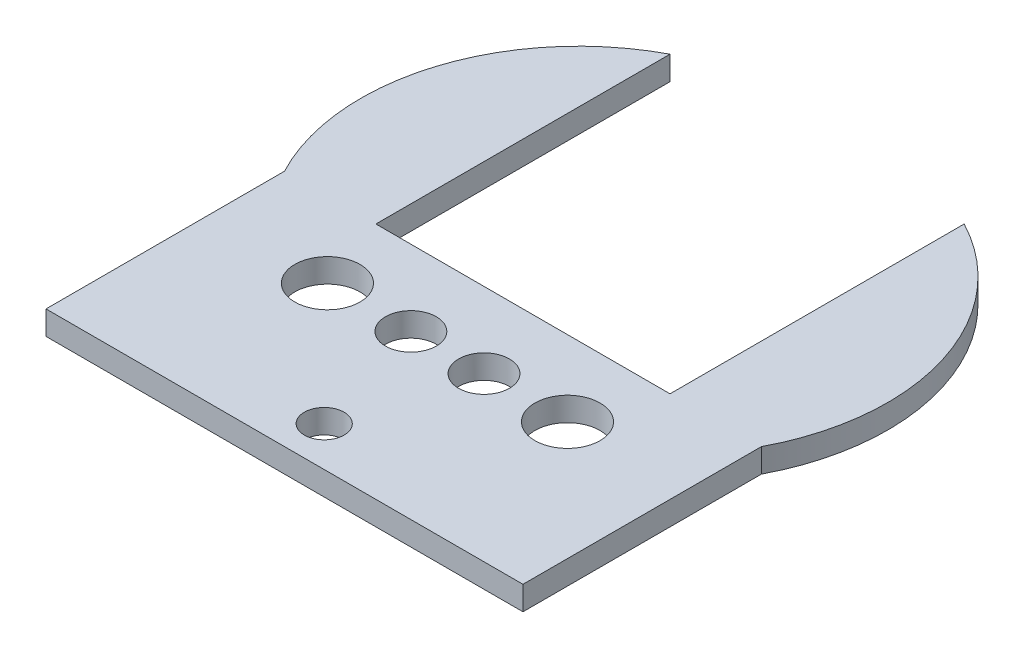
ISO-10303-21;
HEADER;
FILE_DESCRIPTION(('STEP AP214'),'2;1');
FILE_NAME('part.step','',(''),(''),'','','');
FILE_SCHEMA(('AUTOMOTIVE_DESIGN { 1 0 10303 214 1 1 1 1 }'));
ENDSEC;
DATA;
#1=APPLICATION_CONTEXT('core data for automotive mechanical design processes');
#2=APPLICATION_PROTOCOL_DEFINITION('international standard','automotive_design',2000,#1);
#3=PRODUCT_CONTEXT('',#1,'mechanical');
#4=PRODUCT('Part','Part','',(#3));
#5=PRODUCT_RELATED_PRODUCT_CATEGORY('part','',(#4));
#6=PRODUCT_DEFINITION_FORMATION('','',#4);
#7=PRODUCT_DEFINITION_CONTEXT('part definition',#1,'design');
#8=PRODUCT_DEFINITION('design','',#6,#7);
#9=PRODUCT_DEFINITION_SHAPE('','',#8);
#10=(LENGTH_UNIT() NAMED_UNIT(*) SI_UNIT(.MILLI.,.METRE.));
#11=(NAMED_UNIT(*) PLANE_ANGLE_UNIT() SI_UNIT($,.RADIAN.));
#12=(NAMED_UNIT(*) SI_UNIT($,.STERADIAN.) SOLID_ANGLE_UNIT());
#13=UNCERTAINTY_MEASURE_WITH_UNIT(LENGTH_MEASURE(1.E-05),#10,'distance_accuracy_value','');
#14=(GEOMETRIC_REPRESENTATION_CONTEXT(3) GLOBAL_UNCERTAINTY_ASSIGNED_CONTEXT((#13)) GLOBAL_UNIT_ASSIGNED_CONTEXT((#10,
#11,#12)) REPRESENTATION_CONTEXT('',''));
#15=CARTESIAN_POINT('',(0.,0.,0.));
#16=DIRECTION('',(0.,0.,1.));
#17=DIRECTION('',(1.,0.,0.));
#18=AXIS2_PLACEMENT_3D('',#15,#16,#17);
#19=CARTESIAN_POINT('',(-19.8017026169906,3.,0.));
#20=DIRECTION('',(-1.,0.,0.));
#21=DIRECTION('',(0.,0.,1.));
#22=AXIS2_PLACEMENT_3D('',#19,#20,#21);
#23=PLANE('',#22);
#24=DIRECTION('',(0.,0.,-1.));
#25=VECTOR('',#24,1.);
#26=CARTESIAN_POINT('',(-19.8017026169906,0.,0.));
#27=LINE('',#26,#25);
#28=CARTESIAN_POINT('',(-19.8017026169906,0.,0.));
#29=VERTEX_POINT('',#28);
#30=CARTESIAN_POINT('',(-19.8017026169906,0.,-37.));
#31=VERTEX_POINT('',#30);
#32=EDGE_CURVE('E131',#29,#31,#27,.T.);
#33=ORIENTED_EDGE('',*,*,#32,.T.);
#34=DIRECTION('',(0.,-1.,0.));
#35=VECTOR('',#34,1.);
#36=CARTESIAN_POINT('',(-19.8017026169906,3.,-37.));
#37=LINE('',#36,#35);
#38=CARTESIAN_POINT('',(-19.8017026169906,3.,-37.));
#39=VERTEX_POINT('',#38);
#40=EDGE_CURVE('E11',#39,#31,#37,.T.);
#41=ORIENTED_EDGE('',*,*,#40,.F.);
#42=DIRECTION('',(0.,0.,-1.));
#43=VECTOR('',#42,1.);
#44=CARTESIAN_POINT('',(-19.8017026169906,3.,0.));
#45=LINE('',#44,#43);
#46=CARTESIAN_POINT('',(-19.8017026169906,3.,0.));
#47=VERTEX_POINT('',#46);
#48=EDGE_CURVE('E146',#47,#39,#45,.T.);
#49=ORIENTED_EDGE('',*,*,#48,.F.);
#50=DIRECTION('',(0.,-1.,0.));
#51=VECTOR('',#50,1.);
#52=CARTESIAN_POINT('',(-19.8017026169906,3.,0.));
#53=LINE('',#52,#51);
#54=EDGE_CURVE('E127',#47,#29,#53,.T.);
#55=ORIENTED_EDGE('',*,*,#54,.T.);
#56=EDGE_LOOP('',(#33,#41,#49,#55));
#57=FACE_BOUND('',#56,.T.);
#58=ADVANCED_FACE('F33',(#57),#23,.F.);
#59=CARTESIAN_POINT('',(-7.0517026169905,3.,-12.75));
#60=DIRECTION('',(0.,-1.,0.));
#61=DIRECTION('',(0.,0.,-1.));
#62=AXIS2_PLACEMENT_3D('',#59,#60,#61);
#63=CYLINDRICAL_SURFACE('',#62,27.3975363855951);
#64=CARTESIAN_POINT('',(-7.0517026169905,0.,-12.75));
#65=DIRECTION('',(0.,1.,0.));
#66=DIRECTION('',(0.,0.,1.));
#67=AXIS2_PLACEMENT_3D('',#64,#65,#66);
#68=CIRCLE('',#67,27.3975363855951);
#69=CARTESIAN_POINT('',(-31.3017026169906,0.,0.));
#70=VERTEX_POINT('',#69);
#71=EDGE_CURVE('E134',#31,#70,#68,.T.);
#72=ORIENTED_EDGE('',*,*,#71,.T.);
#73=DIRECTION('',(0.,-1.,0.));
#74=VECTOR('',#73,1.);
#75=CARTESIAN_POINT('',(-31.3017026169906,3.,0.));
#76=LINE('',#75,#74);
#77=CARTESIAN_POINT('',(-31.3017026169906,3.,0.));
#78=VERTEX_POINT('',#77);
#79=EDGE_CURVE('E42',#78,#70,#76,.T.);
#80=ORIENTED_EDGE('',*,*,#79,.F.);
#81=CARTESIAN_POINT('',(-7.0517026169905,3.,-12.75));
#82=DIRECTION('',(0.,1.,0.));
#83=DIRECTION('',(0.,0.,1.));
#84=AXIS2_PLACEMENT_3D('',#81,#82,#83);
#85=CIRCLE('',#84,27.3975363855951);
#86=EDGE_CURVE('E94',#39,#78,#85,.T.);
#87=ORIENTED_EDGE('',*,*,#86,.F.);
#88=ORIENTED_EDGE('',*,*,#40,.T.);
#89=EDGE_LOOP('',(#72,#80,#87,#88));
#90=FACE_BOUND('',#89,.T.);
#91=ADVANCED_FACE('F222',(#90),#63,.T.);
#92=CARTESIAN_POINT('',(-31.3017026169906,3.,0.));
#93=DIRECTION('',(1.,0.,0.));
#94=DIRECTION('',(0.,0.,-1.));
#95=AXIS2_PLACEMENT_3D('',#92,#93,#94);
#96=PLANE('',#95);
#97=DIRECTION('',(0.,0.,1.));
#98=VECTOR('',#97,1.);
#99=CARTESIAN_POINT('',(-31.3017026169906,0.,0.));
#100=LINE('',#99,#98);
#101=CARTESIAN_POINT('',(-31.3017026169906,0.,30.));
#102=VERTEX_POINT('',#101);
#103=EDGE_CURVE('E137',#70,#102,#100,.T.);
#104=ORIENTED_EDGE('',*,*,#103,.T.);
#105=DIRECTION('',(0.,-1.,0.));
#106=VECTOR('',#105,1.);
#107=CARTESIAN_POINT('',(-31.3017026169906,3.,30.));
#108=LINE('',#107,#106);
#109=CARTESIAN_POINT('',(-31.3017026169906,3.,30.));
#110=VERTEX_POINT('',#109);
#111=EDGE_CURVE('E153',#110,#102,#108,.T.);
#112=ORIENTED_EDGE('',*,*,#111,.F.);
#113=DIRECTION('',(0.,0.,1.));
#114=VECTOR('',#113,1.);
#115=CARTESIAN_POINT('',(-31.3017026169906,3.,0.));
#116=LINE('',#115,#114);
#117=EDGE_CURVE('E190',#78,#110,#116,.T.);
#118=ORIENTED_EDGE('',*,*,#117,.F.);
#119=ORIENTED_EDGE('',*,*,#79,.T.);
#120=EDGE_LOOP('',(#104,#112,#118,#119));
#121=FACE_BOUND('',#120,.T.);
#122=ADVANCED_FACE('F226',(#121),#96,.F.);
#123=CARTESIAN_POINT('',(-31.3017026169906,3.,30.));
#124=DIRECTION('',(0.,0.,-1.));
#125=DIRECTION('',(-1.,0.,0.));
#126=AXIS2_PLACEMENT_3D('',#123,#124,#125);
#127=PLANE('',#126);
#128=DIRECTION('',(1.,0.,0.));
#129=VECTOR('',#128,1.);
#130=CARTESIAN_POINT('',(-31.3017026169906,0.,30.));
#131=LINE('',#130,#129);
#132=CARTESIAN_POINT('',(28.6982973830094,0.,30.));
#133=VERTEX_POINT('',#132);
#134=EDGE_CURVE('E139',#102,#133,#131,.T.);
#135=ORIENTED_EDGE('',*,*,#134,.T.);
#136=DIRECTION('',(0.,-1.,0.));
#137=VECTOR('',#136,1.);
#138=CARTESIAN_POINT('',(28.6982973830094,3.,30.));
#139=LINE('',#138,#137);
#140=CARTESIAN_POINT('',(28.6982973830094,3.,30.));
#141=VERTEX_POINT('',#140);
#142=EDGE_CURVE('E150',#141,#133,#139,.T.);
#143=ORIENTED_EDGE('',*,*,#142,.F.);
#144=DIRECTION('',(1.,0.,0.));
#145=VECTOR('',#144,1.);
#146=CARTESIAN_POINT('',(-31.3017026169906,3.,30.));
#147=LINE('',#146,#145);
#148=EDGE_CURVE('E192',#110,#141,#147,.T.);
#149=ORIENTED_EDGE('',*,*,#148,.F.);
#150=ORIENTED_EDGE('',*,*,#111,.T.);
#151=EDGE_LOOP('',(#135,#143,#149,#150));
#152=FACE_BOUND('',#151,.T.);
#153=ADVANCED_FACE('F198',(#152),#127,.F.);
#154=CARTESIAN_POINT('',(28.6982973830094,3.,30.));
#155=DIRECTION('',(-1.,0.,0.));
#156=DIRECTION('',(0.,0.,1.));
#157=AXIS2_PLACEMENT_3D('',#154,#155,#156);
#158=PLANE('',#157);
#159=DIRECTION('',(0.,0.,-1.));
#160=VECTOR('',#159,1.);
#161=CARTESIAN_POINT('',(28.6982973830094,0.,30.));
#162=LINE('',#161,#160);
#163=CARTESIAN_POINT('',(28.6982973830094,0.,0.));
#164=VERTEX_POINT('',#163);
#165=EDGE_CURVE('E141',#133,#164,#162,.T.);
#166=ORIENTED_EDGE('',*,*,#165,.T.);
#167=DIRECTION('',(0.,-1.,0.));
#168=VECTOR('',#167,1.);
#169=CARTESIAN_POINT('',(28.6982973830094,3.,0.));
#170=LINE('',#169,#168);
#171=CARTESIAN_POINT('',(28.6982973830094,3.,0.));
#172=VERTEX_POINT('',#171);
#173=EDGE_CURVE('E122',#172,#164,#170,.T.);
#174=ORIENTED_EDGE('',*,*,#173,.F.);
#175=DIRECTION('',(0.,0.,-1.));
#176=VECTOR('',#175,1.);
#177=CARTESIAN_POINT('',(28.6982973830094,3.,30.));
#178=LINE('',#177,#176);
#179=EDGE_CURVE('E113',#141,#172,#178,.T.);
#180=ORIENTED_EDGE('',*,*,#179,.F.);
#181=ORIENTED_EDGE('',*,*,#142,.T.);
#182=EDGE_LOOP('',(#166,#174,#180,#181));
#183=FACE_BOUND('',#182,.T.);
#184=ADVANCED_FACE('F202',(#183),#158,.F.);
#185=CARTESIAN_POINT('',(4.44829738300937,3.,-12.75));
#186=DIRECTION('',(0.,-1.,0.));
#187=DIRECTION('',(0.,0.,-1.));
#188=AXIS2_PLACEMENT_3D('',#185,#186,#187);
#189=CYLINDRICAL_SURFACE('',#188,27.397536385595);
#190=CARTESIAN_POINT('',(4.44829738300937,0.,-12.75));
#191=DIRECTION('',(0.,1.,0.));
#192=DIRECTION('',(0.,0.,-1.));
#193=AXIS2_PLACEMENT_3D('',#190,#191,#192);
#194=CIRCLE('',#193,27.397536385595);
#195=CARTESIAN_POINT('',(17.1982973830094,0.,-37.));
#196=VERTEX_POINT('',#195);
#197=EDGE_CURVE('E121',#164,#196,#194,.T.);
#198=ORIENTED_EDGE('',*,*,#197,.T.);
#199=DIRECTION('',(0.,-1.,0.));
#200=VECTOR('',#199,1.);
#201=CARTESIAN_POINT('',(17.1982973830094,3.,-37.));
#202=LINE('',#201,#200);
#203=CARTESIAN_POINT('',(17.1982973830094,3.,-37.));
#204=VERTEX_POINT('',#203);
#205=EDGE_CURVE('E118',#204,#196,#202,.T.);
#206=ORIENTED_EDGE('',*,*,#205,.F.);
#207=CARTESIAN_POINT('',(4.44829738300937,3.,-12.75));
#208=DIRECTION('',(0.,1.,0.));
#209=DIRECTION('',(0.,0.,-1.));
#210=AXIS2_PLACEMENT_3D('',#207,#208,#209);
#211=CIRCLE('',#210,27.397536385595);
#212=EDGE_CURVE('E107',#172,#204,#211,.T.);
#213=ORIENTED_EDGE('',*,*,#212,.F.);
#214=ORIENTED_EDGE('',*,*,#173,.T.);
#215=EDGE_LOOP('',(#198,#206,#213,#214));
#216=FACE_BOUND('',#215,.T.);
#217=ADVANCED_FACE('F119',(#216),#189,.T.);
#218=CARTESIAN_POINT('',(17.1982973830094,3.,0.));
#219=DIRECTION('',(1.,0.,0.));
#220=DIRECTION('',(0.,0.,-1.));
#221=AXIS2_PLACEMENT_3D('',#218,#219,#220);
#222=PLANE('',#221);
#223=DIRECTION('',(0.,0.,1.));
#224=VECTOR('',#223,1.);
#225=CARTESIAN_POINT('',(17.1982973830094,0.,0.));
#226=LINE('',#225,#224);
#227=CARTESIAN_POINT('',(17.1982973830094,0.,0.));
#228=VERTEX_POINT('',#227);
#229=EDGE_CURVE('E80',#196,#228,#226,.T.);
#230=ORIENTED_EDGE('',*,*,#229,.T.);
#231=DIRECTION('',(0.,-1.,0.));
#232=VECTOR('',#231,1.);
#233=CARTESIAN_POINT('',(17.1982973830094,3.,0.));
#234=LINE('',#233,#232);
#235=CARTESIAN_POINT('',(17.1982973830094,3.,0.));
#236=VERTEX_POINT('',#235);
#237=EDGE_CURVE('E123',#236,#228,#234,.T.);
#238=ORIENTED_EDGE('',*,*,#237,.F.);
#239=DIRECTION('',(0.,0.,1.));
#240=VECTOR('',#239,1.);
#241=CARTESIAN_POINT('',(17.1982973830094,3.,0.));
#242=LINE('',#241,#240);
#243=EDGE_CURVE('E111',#204,#236,#242,.T.);
#244=ORIENTED_EDGE('',*,*,#243,.F.);
#245=ORIENTED_EDGE('',*,*,#205,.T.);
#246=EDGE_LOOP('',(#230,#238,#244,#245));
#247=FACE_BOUND('',#246,.T.);
#248=ADVANCED_FACE('F125',(#247),#222,.F.);
#249=CARTESIAN_POINT('',(-19.8017026169906,3.,0.));
#250=DIRECTION('',(0.,0.,1.));
#251=DIRECTION('',(1.,0.,0.));
#252=AXIS2_PLACEMENT_3D('',#249,#250,#251);
#253=PLANE('',#252);
#254=DIRECTION('',(-1.,0.,0.));
#255=VECTOR('',#254,1.);
#256=CARTESIAN_POINT('',(-19.8017026169906,0.,0.));
#257=LINE('',#256,#255);
#258=EDGE_CURVE('E86',#228,#29,#257,.T.);
#259=ORIENTED_EDGE('',*,*,#258,.T.);
#260=ORIENTED_EDGE('',*,*,#54,.F.);
#261=DIRECTION('',(-1.,0.,0.));
#262=VECTOR('',#261,1.);
#263=CARTESIAN_POINT('',(-19.8017026169906,3.,0.));
#264=LINE('',#263,#262);
#265=EDGE_CURVE('E51',#236,#47,#264,.T.);
#266=ORIENTED_EDGE('',*,*,#265,.F.);
#267=ORIENTED_EDGE('',*,*,#237,.T.);
#268=EDGE_LOOP('',(#259,#260,#266,#267));
#269=FACE_BOUND('',#268,.T.);
#270=ADVANCED_FACE('F210',(#269),#253,.F.);
#271=CARTESIAN_POINT('',(-7.0517026169905,3.,-12.75));
#272=DIRECTION('',(0.,1.,0.));
#273=DIRECTION('',(0.,0.,1.));
#274=AXIS2_PLACEMENT_3D('',#271,#272,#273);
#275=PLANE('',#274);
#276=CARTESIAN_POINT('',(-5.90170261699063,3.,9.49999999999999));
#277=DIRECTION('',(0.,1.,0.));
#278=DIRECTION('',(0.,0.,1.));
#279=AXIS2_PLACEMENT_3D('',#276,#277,#278);
#280=CIRCLE('',#279,3.2);
#281=CARTESIAN_POINT('',(-5.90170261699063,3.,12.7));
#282=VERTEX_POINT('',#281);
#283=EDGE_CURVE('E162',#282,#282,#280,.T.);
#284=ORIENTED_EDGE('',*,*,#283,.F.);
#285=EDGE_LOOP('',(#284));
#286=FACE_BOUND('',#285,.T.);
#287=CARTESIAN_POINT('',(3.29829738300937,3.,9.49999999999999));
#288=DIRECTION('',(0.,1.,0.));
#289=DIRECTION('',(0.,0.,-1.));
#290=AXIS2_PLACEMENT_3D('',#287,#288,#289);
#291=CIRCLE('',#290,3.2);
#292=CARTESIAN_POINT('',(3.29829738300937,3.,6.29999999999999));
#293=VERTEX_POINT('',#292);
#294=EDGE_CURVE('E168',#293,#293,#291,.T.);
#295=ORIENTED_EDGE('',*,*,#294,.F.);
#296=EDGE_LOOP('',(#295));
#297=FACE_BOUND('',#296,.T.);
#298=CARTESIAN_POINT('',(13.7982973830094,3.,9.5));
#299=DIRECTION('',(0.,1.,0.));
#300=DIRECTION('',(0.,0.,1.));
#301=AXIS2_PLACEMENT_3D('',#298,#299,#300);
#302=CIRCLE('',#301,4.1);
#303=CARTESIAN_POINT('',(13.7982973830094,3.,13.6));
#304=VERTEX_POINT('',#303);
#305=EDGE_CURVE('E183',#304,#304,#302,.T.);
#306=ORIENTED_EDGE('',*,*,#305,.F.);
#307=EDGE_LOOP('',(#306));
#308=FACE_BOUND('',#307,.T.);
#309=CARTESIAN_POINT('',(-16.4017026169906,3.,9.5));
#310=DIRECTION('',(0.,1.,0.));
#311=DIRECTION('',(0.,0.,1.));
#312=AXIS2_PLACEMENT_3D('',#309,#310,#311);
#313=CIRCLE('',#312,4.1);
#314=CARTESIAN_POINT('',(-16.4017026169906,3.,13.6));
#315=VERTEX_POINT('',#314);
#316=EDGE_CURVE('E178',#315,#315,#313,.T.);
#317=ORIENTED_EDGE('',*,*,#316,.F.);
#318=EDGE_LOOP('',(#317));
#319=FACE_BOUND('',#318,.T.);
#320=CARTESIAN_POINT('',(-1.30170261699063,3.,25.));
#321=DIRECTION('',(0.,1.,0.));
#322=DIRECTION('',(0.,0.,1.));
#323=AXIS2_PLACEMENT_3D('',#320,#321,#322);
#324=CIRCLE('',#323,2.5);
#325=CARTESIAN_POINT('',(-1.30170261699063,3.,27.5));
#326=VERTEX_POINT('',#325);
#327=EDGE_CURVE('E159',#326,#326,#324,.T.);
#328=ORIENTED_EDGE('',*,*,#327,.F.);
#329=EDGE_LOOP('',(#328));
#330=FACE_BOUND('',#329,.T.);
#331=ORIENTED_EDGE('',*,*,#48,.T.);
#332=ORIENTED_EDGE('',*,*,#86,.T.);
#333=ORIENTED_EDGE('',*,*,#117,.T.);
#334=ORIENTED_EDGE('',*,*,#148,.T.);
#335=ORIENTED_EDGE('',*,*,#179,.T.);
#336=ORIENTED_EDGE('',*,*,#212,.T.);
#337=ORIENTED_EDGE('',*,*,#243,.T.);
#338=ORIENTED_EDGE('',*,*,#265,.T.);
#339=EDGE_LOOP('',(#331,#332,#333,#334,#335,#336,#337,#338));
#340=FACE_BOUND('',#339,.T.);
#341=ADVANCED_FACE('F109',(#286,#297,#308,#319,#330,#340),#275,.T.);
#342=CARTESIAN_POINT('',(-7.0517026169905,0.,-12.75));
#343=DIRECTION('',(0.,1.,0.));
#344=DIRECTION('',(0.,0.,1.));
#345=AXIS2_PLACEMENT_3D('',#342,#343,#344);
#346=PLANE('',#345);
#347=CARTESIAN_POINT('',(-5.90170261699063,0.,9.49999999999999));
#348=DIRECTION('',(0.,1.,0.));
#349=DIRECTION('',(0.,0.,1.));
#350=AXIS2_PLACEMENT_3D('',#347,#348,#349);
#351=CIRCLE('',#350,3.2);
#352=CARTESIAN_POINT('',(-5.90170261699063,0.,12.7));
#353=VERTEX_POINT('',#352);
#354=EDGE_CURVE('E36',#353,#353,#351,.T.);
#355=ORIENTED_EDGE('',*,*,#354,.T.);
#356=EDGE_LOOP('',(#355));
#357=FACE_BOUND('',#356,.T.);
#358=CARTESIAN_POINT('',(3.29829738300937,0.,9.49999999999999));
#359=DIRECTION('',(0.,1.,0.));
#360=DIRECTION('',(0.,0.,1.));
#361=AXIS2_PLACEMENT_3D('',#358,#359,#360);
#362=CIRCLE('',#361,3.2);
#363=CARTESIAN_POINT('',(3.29829738300937,0.,12.7));
#364=VERTEX_POINT('',#363);
#365=EDGE_CURVE('E160',#364,#364,#362,.T.);
#366=ORIENTED_EDGE('',*,*,#365,.T.);
#367=EDGE_LOOP('',(#366));
#368=FACE_BOUND('',#367,.T.);
#369=CARTESIAN_POINT('',(13.7982973830094,0.,9.5));
#370=DIRECTION('',(0.,-1.,0.));
#371=DIRECTION('',(0.,0.,-1.));
#372=AXIS2_PLACEMENT_3D('',#369,#370,#371);
#373=CIRCLE('',#372,4.1);
#374=CARTESIAN_POINT('',(13.7982973830094,0.,5.4));
#375=VERTEX_POINT('',#374);
#376=EDGE_CURVE('E175',#375,#375,#373,.T.);
#377=ORIENTED_EDGE('',*,*,#376,.F.);
#378=EDGE_LOOP('',(#377));
#379=FACE_BOUND('',#378,.T.);
#380=CARTESIAN_POINT('',(-16.4017026169906,0.,9.5));
#381=DIRECTION('',(0.,-1.,0.));
#382=DIRECTION('',(0.,0.,1.));
#383=AXIS2_PLACEMENT_3D('',#380,#381,#382);
#384=CIRCLE('',#383,4.1);
#385=CARTESIAN_POINT('',(-16.4017026169906,0.,13.6));
#386=VERTEX_POINT('',#385);
#387=EDGE_CURVE('E166',#386,#386,#384,.T.);
#388=ORIENTED_EDGE('',*,*,#387,.F.);
#389=EDGE_LOOP('',(#388));
#390=FACE_BOUND('',#389,.T.);
#391=CARTESIAN_POINT('',(-1.30170261699063,0.,25.));
#392=DIRECTION('',(0.,1.,0.));
#393=DIRECTION('',(0.,0.,1.));
#394=AXIS2_PLACEMENT_3D('',#391,#392,#393);
#395=CIRCLE('',#394,2.5);
#396=CARTESIAN_POINT('',(-1.30170261699063,0.,27.5));
#397=VERTEX_POINT('',#396);
#398=EDGE_CURVE('E135',#397,#397,#395,.T.);
#399=ORIENTED_EDGE('',*,*,#398,.T.);
#400=EDGE_LOOP('',(#399));
#401=FACE_BOUND('',#400,.T.);
#402=ORIENTED_EDGE('',*,*,#32,.F.);
#403=ORIENTED_EDGE('',*,*,#258,.F.);
#404=ORIENTED_EDGE('',*,*,#229,.F.);
#405=ORIENTED_EDGE('',*,*,#197,.F.);
#406=ORIENTED_EDGE('',*,*,#165,.F.);
#407=ORIENTED_EDGE('',*,*,#134,.F.);
#408=ORIENTED_EDGE('',*,*,#103,.F.);
#409=ORIENTED_EDGE('',*,*,#71,.F.);
#410=EDGE_LOOP('',(#402,#403,#404,#405,#406,#407,#408,#409));
#411=FACE_BOUND('',#410,.T.);
#412=ADVANCED_FACE('F205',(#357,#368,#379,#390,#401,#411),#346,.F.);
#413=CARTESIAN_POINT('',(-1.30170261699063,-17.,25.));
#414=DIRECTION('',(0.,1.,0.));
#415=DIRECTION('',(0.,0.,1.));
#416=AXIS2_PLACEMENT_3D('',#413,#414,#415);
#417=CYLINDRICAL_SURFACE('',#416,2.5);
#418=ORIENTED_EDGE('',*,*,#327,.T.);
#419=EDGE_LOOP('',(#418));
#420=FACE_BOUND('',#419,.T.);
#421=ORIENTED_EDGE('',*,*,#398,.F.);
#422=EDGE_LOOP('',(#421));
#423=FACE_BOUND('',#422,.T.);
#424=ADVANCED_FACE('F256',(#420,#423),#417,.F.);
#425=CARTESIAN_POINT('',(-16.4017026169906,10.,9.5));
#426=DIRECTION('',(0.,-1.,0.));
#427=DIRECTION('',(0.,0.,-1.));
#428=AXIS2_PLACEMENT_3D('',#425,#426,#427);
#429=CYLINDRICAL_SURFACE('',#428,4.1);
#430=ORIENTED_EDGE('',*,*,#316,.T.);
#431=EDGE_LOOP('',(#430));
#432=FACE_BOUND('',#431,.T.);
#433=ORIENTED_EDGE('',*,*,#387,.T.);
#434=EDGE_LOOP('',(#433));
#435=FACE_BOUND('',#434,.T.);
#436=ADVANCED_FACE('F261',(#432,#435),#429,.F.);
#437=CARTESIAN_POINT('',(13.7982973830094,10.,9.5));
#438=DIRECTION('',(0.,-1.,0.));
#439=DIRECTION('',(0.,0.,-1.));
#440=AXIS2_PLACEMENT_3D('',#437,#438,#439);
#441=CYLINDRICAL_SURFACE('',#440,4.1);
#442=ORIENTED_EDGE('',*,*,#305,.T.);
#443=EDGE_LOOP('',(#442));
#444=FACE_BOUND('',#443,.T.);
#445=ORIENTED_EDGE('',*,*,#376,.T.);
#446=EDGE_LOOP('',(#445));
#447=FACE_BOUND('',#446,.T.);
#448=ADVANCED_FACE('F273',(#444,#447),#441,.F.);
#449=CARTESIAN_POINT('',(3.29829738300937,-7.,9.49999999999999));
#450=DIRECTION('',(0.,1.,0.));
#451=DIRECTION('',(0.,0.,1.));
#452=AXIS2_PLACEMENT_3D('',#449,#450,#451);
#453=CYLINDRICAL_SURFACE('',#452,3.2);
#454=ORIENTED_EDGE('',*,*,#294,.T.);
#455=EDGE_LOOP('',(#454));
#456=FACE_BOUND('',#455,.T.);
#457=ORIENTED_EDGE('',*,*,#365,.F.);
#458=EDGE_LOOP('',(#457));
#459=FACE_BOUND('',#458,.T.);
#460=ADVANCED_FACE('F283',(#456,#459),#453,.F.);
#461=CARTESIAN_POINT('',(-5.90170261699063,-7.,9.49999999999999));
#462=DIRECTION('',(0.,1.,0.));
#463=DIRECTION('',(0.,0.,1.));
#464=AXIS2_PLACEMENT_3D('',#461,#462,#463);
#465=CYLINDRICAL_SURFACE('',#464,3.2);
#466=ORIENTED_EDGE('',*,*,#283,.T.);
#467=EDGE_LOOP('',(#466));
#468=FACE_BOUND('',#467,.T.);
#469=ORIENTED_EDGE('',*,*,#354,.F.);
#470=EDGE_LOOP('',(#469));
#471=FACE_BOUND('',#470,.T.);
#472=ADVANCED_FACE('F304',(#468,#471),#465,.F.);
#473=CLOSED_SHELL('',(#58,#91,#122,#153,#184,#217,#248,#270,#341,#412,#424,#436,#448,#460,#472));
#474=MANIFOLD_SOLID_BREP('B2',#473);
#475=ADVANCED_BREP_SHAPE_REPRESENTATION('',(#18,#474),#14);
#476=SHAPE_DEFINITION_REPRESENTATION(#9,#475);
ENDSEC;
END-ISO-10303-21;
